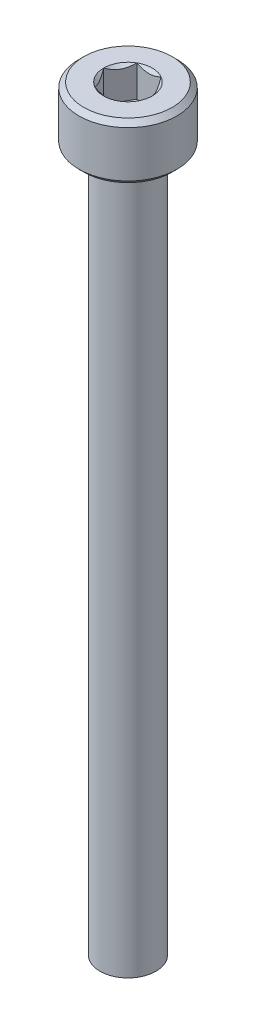
ISO-10303-21;
HEADER;
FILE_DESCRIPTION(('STEP AP214'),'2;1');
FILE_NAME('part.step','',(''),(''),'','','');
FILE_SCHEMA(('AUTOMOTIVE_DESIGN { 1 0 10303 214 1 1 1 1 }'));
ENDSEC;
DATA;
#1=APPLICATION_CONTEXT('core data for automotive mechanical design processes');
#2=APPLICATION_PROTOCOL_DEFINITION('international standard','automotive_design',2000,#1);
#3=PRODUCT_CONTEXT('',#1,'mechanical');
#4=PRODUCT('Part','Part','',(#3));
#5=PRODUCT_RELATED_PRODUCT_CATEGORY('part','',(#4));
#6=PRODUCT_DEFINITION_FORMATION('','',#4);
#7=PRODUCT_DEFINITION_CONTEXT('part definition',#1,'design');
#8=PRODUCT_DEFINITION('design','',#6,#7);
#9=PRODUCT_DEFINITION_SHAPE('','',#8);
#10=(LENGTH_UNIT() NAMED_UNIT(*) SI_UNIT(.MILLI.,.METRE.));
#11=(NAMED_UNIT(*) PLANE_ANGLE_UNIT() SI_UNIT($,.RADIAN.));
#12=(NAMED_UNIT(*) SI_UNIT($,.STERADIAN.) SOLID_ANGLE_UNIT());
#13=UNCERTAINTY_MEASURE_WITH_UNIT(LENGTH_MEASURE(1.E-05),#10,'distance_accuracy_value','');
#14=(GEOMETRIC_REPRESENTATION_CONTEXT(3) GLOBAL_UNCERTAINTY_ASSIGNED_CONTEXT((#13)) GLOBAL_UNIT_ASSIGNED_CONTEXT((#10,
#11,#12)) REPRESENTATION_CONTEXT('',''));
#15=CARTESIAN_POINT('',(0.,0.,0.));
#16=DIRECTION('',(0.,0.,1.));
#17=DIRECTION('',(1.,0.,0.));
#18=AXIS2_PLACEMENT_3D('',#15,#16,#17);
#19=CARTESIAN_POINT('',(0.,4.,0.));
#20=DIRECTION('',(0.,-1.,0.));
#21=DIRECTION('',(0.,0.,-1.));
#22=AXIS2_PLACEMENT_3D('',#19,#20,#21);
#23=CYLINDRICAL_SURFACE('',#22,3.5);
#24=CARTESIAN_POINT('',(0.,0.350000000000001,0.));
#25=DIRECTION('',(0.,1.,0.));
#26=DIRECTION('',(0.,0.,1.));
#27=AXIS2_PLACEMENT_3D('',#24,#25,#26);
#28=CIRCLE('',#27,3.5);
#29=CARTESIAN_POINT('',(0.,0.350000000000001,3.5));
#30=VERTEX_POINT('',#29);
#31=EDGE_CURVE('E222',#30,#30,#28,.T.);
#32=ORIENTED_EDGE('',*,*,#31,.T.);
#33=EDGE_LOOP('',(#32));
#34=FACE_BOUND('',#33,.T.);
#35=CARTESIAN_POINT('',(0.,3.65,0.));
#36=DIRECTION('',(0.,1.,0.));
#37=DIRECTION('',(0.,0.,1.));
#38=AXIS2_PLACEMENT_3D('',#35,#36,#37);
#39=CIRCLE('',#38,3.5);
#40=CARTESIAN_POINT('',(0.,3.65,3.5));
#41=VERTEX_POINT('',#40);
#42=EDGE_CURVE('E105',#41,#41,#39,.F.);
#43=ORIENTED_EDGE('',*,*,#42,.T.);
#44=EDGE_LOOP('',(#43));
#45=FACE_BOUND('',#44,.T.);
#46=ADVANCED_FACE('F33',(#34,#45),#23,.T.);
#47=CARTESIAN_POINT('',(0.,4.,0.));
#48=DIRECTION('',(0.,1.,0.));
#49=DIRECTION('',(0.,0.,1.));
#50=AXIS2_PLACEMENT_3D('',#47,#48,#49);
#51=PLANE('',#50);
#52=CARTESIAN_POINT('',(0.,4.,0.));
#53=DIRECTION('',(0.,1.,0.));
#54=DIRECTION('',(0.,0.,1.));
#55=AXIS2_PLACEMENT_3D('',#52,#53,#54);
#56=CIRCLE('',#55,3.15);
#57=CARTESIAN_POINT('',(0.,4.,3.15));
#58=VERTEX_POINT('',#57);
#59=EDGE_CURVE('E37',#58,#58,#56,.T.);
#60=ORIENTED_EDGE('',*,*,#59,.T.);
#61=EDGE_LOOP('',(#60));
#62=FACE_BOUND('',#61,.T.);
#63=CARTESIAN_POINT('',(0.,4.,0.));
#64=DIRECTION('',(0.,1.,0.));
#65=DIRECTION('',(0.,0.,1.));
#66=AXIS2_PLACEMENT_3D('',#63,#64,#65);
#67=CIRCLE('',#66,1.73205080756888);
#68=CARTESIAN_POINT('',(0.866025403784438,4.,1.5));
#69=VERTEX_POINT('',#68);
#70=CARTESIAN_POINT('',(1.73205080756888,4.,0.));
#71=VERTEX_POINT('',#70);
#72=EDGE_CURVE('E48',#69,#71,#67,.T.);
#73=ORIENTED_EDGE('',*,*,#72,.F.);
#74=CARTESIAN_POINT('',(-0.866025403784438,4.,1.5));
#75=VERTEX_POINT('',#74);
#76=EDGE_CURVE('E55',#75,#69,#67,.T.);
#77=ORIENTED_EDGE('',*,*,#76,.F.);
#78=CARTESIAN_POINT('',(-1.73205080756888,4.,0.));
#79=VERTEX_POINT('',#78);
#80=EDGE_CURVE('E128',#79,#75,#67,.T.);
#81=ORIENTED_EDGE('',*,*,#80,.F.);
#82=CARTESIAN_POINT('',(-0.866025403784439,4.,-1.5));
#83=VERTEX_POINT('',#82);
#84=EDGE_CURVE('E127',#83,#79,#67,.T.);
#85=ORIENTED_EDGE('',*,*,#84,.F.);
#86=CARTESIAN_POINT('',(0.866025403784438,4.,-1.5));
#87=VERTEX_POINT('',#86);
#88=EDGE_CURVE('E95',#87,#83,#67,.T.);
#89=ORIENTED_EDGE('',*,*,#88,.F.);
#90=EDGE_CURVE('E87',#71,#87,#67,.T.);
#91=ORIENTED_EDGE('',*,*,#90,.F.);
#92=EDGE_LOOP('',(#73,#77,#81,#85,#89,#91));
#93=FACE_BOUND('',#92,.T.);
#94=ADVANCED_FACE('F125',(#62,#93),#51,.T.);
#95=CARTESIAN_POINT('',(0.,0.,0.));
#96=DIRECTION('',(0.,1.,0.));
#97=DIRECTION('',(0.,0.,1.));
#98=AXIS2_PLACEMENT_3D('',#95,#96,#97);
#99=PLANE('',#98);
#100=CARTESIAN_POINT('',(0.,0.,0.));
#101=DIRECTION('',(0.,-1.,0.));
#102=DIRECTION('',(0.,0.,-1.));
#103=AXIS2_PLACEMENT_3D('',#100,#101,#102);
#104=CIRCLE('',#103,2.);
#105=CARTESIAN_POINT('',(0.,0.,-2.));
#106=VERTEX_POINT('',#105);
#107=EDGE_CURVE('E11',#106,#106,#104,.T.);
#108=ORIENTED_EDGE('',*,*,#107,.F.);
#109=EDGE_LOOP('',(#108));
#110=FACE_BOUND('',#109,.T.);
#111=CARTESIAN_POINT('',(0.,0.,0.));
#112=DIRECTION('',(0.,1.,0.));
#113=DIRECTION('',(0.,0.,1.));
#114=AXIS2_PLACEMENT_3D('',#111,#112,#113);
#115=CIRCLE('',#114,3.15);
#116=CARTESIAN_POINT('',(0.,0.,3.15));
#117=VERTEX_POINT('',#116);
#118=EDGE_CURVE('E220',#117,#117,#115,.F.);
#119=ORIENTED_EDGE('',*,*,#118,.T.);
#120=EDGE_LOOP('',(#119));
#121=FACE_BOUND('',#120,.T.);
#122=ADVANCED_FACE('F203',(#110,#121),#99,.F.);
#123=CARTESIAN_POINT('',(0.,4.,0.));
#124=DIRECTION('',(0.,1.,0.));
#125=DIRECTION('',(0.,0.,1.));
#126=AXIS2_PLACEMENT_3D('',#123,#124,#125);
#127=CONICAL_SURFACE('',#126,1.73205080756888,0.78539816339745);
#128=ORIENTED_EDGE('',*,*,#88,.T.);
#129=CARTESIAN_POINT('',(-1.72720812969692,4.55557851627079,-1.5));
#130=CARTESIAN_POINT('',(-1.68515175699268,4.52382990785743,-1.5));
#131=CARTESIAN_POINT('',(-1.64286104748673,4.49239259380738,-1.5));
#132=CARTESIAN_POINT('',(-1.55771581035942,4.43026908755641,-1.5));
#133=CARTESIAN_POINT('',(-1.51486114386668,4.3995830858922,-1.5));
#134=CARTESIAN_POINT('',(-1.3846813415127,4.30840719242716,-1.5));
#135=CARTESIAN_POINT('',(-1.29637976071654,4.24928834342677,-1.5));
#136=CARTESIAN_POINT('',(-1.11121478730467,4.1332309963165,-1.5));
#137=CARTESIAN_POINT('',(-1.01415038238167,4.07660955873301,-1.5));
#138=CARTESIAN_POINT('',(-0.815173408897606,3.97303688126565,-1.5));
#139=CARTESIAN_POINT('',(-0.713278669253285,3.92605304154167,-1.5));
#140=CARTESIAN_POINT('',(-0.560333774943112,3.86857266843083,-1.5));
#141=CARTESIAN_POINT('',(-0.511547982948042,3.85207538775725,-1.5));
#142=CARTESIAN_POINT('',(-0.412798620136866,3.822997512927,-1.5));
#143=CARTESIAN_POINT('',(-0.362834968437563,3.81041718859402,-1.5));
#144=CARTESIAN_POINT('',(-0.262863235444982,3.79003619414677,-1.5));
#145=CARTESIAN_POINT('',(-0.212872113808023,3.78215363274598,-1.5));
#146=CARTESIAN_POINT('',(-0.112355243569545,3.771322063969,-1.5));
#147=CARTESIAN_POINT('',(-0.0618295883726279,3.76837220852435,-1.5));
#148=CARTESIAN_POINT('',(0.037429173332384,3.76762485772485,-1.5));
#149=CARTESIAN_POINT('',(0.0861609672002989,3.76964473355808,-1.5));
#150=CARTESIAN_POINT('',(0.183206937768827,3.77832255289676,-1.5));
#151=CARTESIAN_POINT('',(0.231521073438269,3.78498094696846,-1.5));
#152=CARTESIAN_POINT('',(0.328199853425436,3.80268524412257,-1.5));
#153=CARTESIAN_POINT('',(0.376550616310328,3.81380581125704,-1.5));
#154=CARTESIAN_POINT('',(0.472195697125598,3.83984341404871,-1.5));
#155=CARTESIAN_POINT('',(0.51949010309274,3.85476013204094,-1.5));
#156=CARTESIAN_POINT('',(0.668391282696624,3.90733522359607,-1.5));
#157=CARTESIAN_POINT('',(0.767878709508552,3.95098128747198,-1.5));
#158=CARTESIAN_POINT('',(0.962179866690724,4.0480229945931,-1.5));
#159=CARTESIAN_POINT('',(1.05697519961444,4.10145366508953,-1.5));
#160=CARTESIAN_POINT('',(1.23814273533383,4.21168585200456,-1.5));
#161=CARTESIAN_POINT('',(1.3246994218129,4.2681879206986,-1.5));
#162=CARTESIAN_POINT('',(1.45222331290673,4.35553430157866,-1.5));
#163=CARTESIAN_POINT('',(1.49418091978756,4.38495775868004,-1.5));
#164=CARTESIAN_POINT('',(1.57752272931476,4.44458282183046,-1.5));
#165=CARTESIAN_POINT('',(1.61890708647354,4.47478421166444,-1.5));
#166=CARTESIAN_POINT('',(1.66005278019494,4.50530817860946,-1.5));
#167=B_SPLINE_CURVE_WITH_KNOTS('',3,(#129,#130,#131,#132,#133,#134,#135,#136,#137,#138,#139,
#140,#141,#142,#143,#144,#145,#146,#147,#148,#149,#150,#151,#152,#153,#154,#155,#156,#157,#158,
#159,#160,#161,#162,#163,#164,#165,#166),.UNSPECIFIED.,.F.,.F.,(4,2,2,2,2,2,2,2,2,2,2,2,2,2,2,2,
2,2,4),(0.,0.158079548982669,0.316198780993942,0.634850417346958,0.971690311361509,
1.30737131660667,1.46173961127089,1.61611853740677,1.76772101421409,1.91929742368538,
2.065387412096,2.21149159305544,2.36014984633872,2.50879566386709,2.83376031422673,
3.15991186985652,3.46985601802197,3.62358896039974,3.7772796264207),.UNSPECIFIED.);
#168=EDGE_CURVE('E100',#87,#83,#167,.F.);
#169=ORIENTED_EDGE('',*,*,#168,.F.);
#170=EDGE_LOOP('',(#128,#169));
#171=FACE_BOUND('',#170,.T.);
#172=ADVANCED_FACE('F101',(#171),#127,.F.);
#173=ORIENTED_EDGE('',*,*,#84,.T.);
#174=CARTESIAN_POINT('',(-0.865909933730601,4.00011548160007,-1.5002));
#175=CARTESIAN_POINT('',(-0.895682611594166,3.97036547606733,-1.44863220926292));
#176=CARTESIAN_POINT('',(-0.925953159489765,3.94236248391031,-1.3962020823348));
#177=CARTESIAN_POINT('',(-0.987678321317123,3.89108923044014,-1.2892909659444));
#178=CARTESIAN_POINT('',(-1.01913880822717,3.86784750504437,-1.23479980418534));
#179=CARTESIAN_POINT('',(-1.08257741237344,3.82803372899222,-1.12492091864275));
#180=CARTESIAN_POINT('',(-1.11453936608521,3.8113615856709,-1.0695611909048));
#181=CARTESIAN_POINT('',(-1.1791670593912,3.7856744568181,-0.957622742522849));
#182=CARTESIAN_POINT('',(-1.21183082354213,3.77664029047887,-0.901047443446992));
#183=CARTESIAN_POINT('',(-1.26812411040032,3.76848908122685,-0.803544610483559));
#184=CARTESIAN_POINT('',(-1.29168087824208,3.76728225298922,-0.762743091719534));
#185=CARTESIAN_POINT('',(-1.33875285845138,3.76931405716227,-0.681212030384142));
#186=CARTESIAN_POINT('',(-1.36226806050018,3.77255367074831,-0.64048250568537));
#187=CARTESIAN_POINT('',(-1.40907206156905,3.78329198598196,-0.559415597836584));
#188=CARTESIAN_POINT('',(-1.43236062923612,3.79079465301873,-0.519078615401712));
#189=CARTESIAN_POINT('',(-1.47854689118996,3.80965161192829,-0.439081663085969));
#190=CARTESIAN_POINT('',(-1.50144441326545,3.82100755701858,-0.399421991483792));
#191=CARTESIAN_POINT('',(-1.56009461325633,3.85472164759267,-0.297836865225515));
#192=CARTESIAN_POINT('',(-1.59548353987866,3.87962184909337,-0.236541446290311));
#193=CARTESIAN_POINT('',(-1.64751843074894,3.92165665327158,-0.146414371536686));
#194=CARTESIAN_POINT('',(-1.66466545167617,3.9364251535591,-0.116714860092282));
#195=CARTESIAN_POINT('',(-1.69864410935691,3.96731056594017,-0.0578620986162487));
#196=CARTESIAN_POINT('',(-1.71547589206761,3.98342683412171,-0.0287085957793624));
#197=CARTESIAN_POINT('',(-1.73216627762272,4.00011548160007,0.00020000000000028));
#198=B_SPLINE_CURVE_WITH_KNOTS('',3,(#174,#175,#176,#177,#178,#179,#180,#181,#182,#183,#184,
#185,#186,#187,#188,#189,#190,#191,#192,#193,#194,#195,#196,#197),.UNSPECIFIED.,.F.,.F.,(4,2,2,
2,2,2,2,2,2,2,2,4),(0.,0.199829143693304,0.400822987382388,0.598623720538181,0.795926240188889,
0.937113067959881,1.07833105577193,1.21968061668222,1.36109089931054,1.58570969637565,
1.69770705470964,1.80965120737194),.UNSPECIFIED.);
#199=EDGE_CURVE('E130',#83,#79,#198,.T.);
#200=ORIENTED_EDGE('',*,*,#199,.F.);
#201=EDGE_LOOP('',(#173,#200));
#202=FACE_BOUND('',#201,.T.);
#203=ADVANCED_FACE('F237',(#202),#127,.F.);
#204=ORIENTED_EDGE('',*,*,#80,.T.);
#205=CARTESIAN_POINT('',(-1.73216627762272,4.00011548160007,-0.000199999999999694));
#206=CARTESIAN_POINT('',(-1.70239359975915,3.97036547606733,0.051367790737076));
#207=CARTESIAN_POINT('',(-1.67212305186355,3.94236248391031,0.103797917665201));
#208=CARTESIAN_POINT('',(-1.61039789003619,3.89108923044014,0.210709034055597));
#209=CARTESIAN_POINT('',(-1.57893740312614,3.86784750504437,0.265200195814662));
#210=CARTESIAN_POINT('',(-1.51549879897987,3.82803372899222,0.375079081357249));
#211=CARTESIAN_POINT('',(-1.4835368452681,3.8113615856709,0.4304388090952));
#212=CARTESIAN_POINT('',(-1.41890915196211,3.7856744568181,0.542377257477151));
#213=CARTESIAN_POINT('',(-1.38624538781118,3.77664029047887,0.598952556553009));
#214=CARTESIAN_POINT('',(-1.32995210095299,3.76848908122685,0.696455389516441));
#215=CARTESIAN_POINT('',(-1.30639533311124,3.76728225298922,0.737256908280466));
#216=CARTESIAN_POINT('',(-1.25932335290193,3.76931405716227,0.818787969615858));
#217=CARTESIAN_POINT('',(-1.23580815085313,3.77255367074831,0.85951749431463));
#218=CARTESIAN_POINT('',(-1.18900414978427,3.78329198598196,0.940584402163416));
#219=CARTESIAN_POINT('',(-1.1657155821172,3.79079465301873,0.980921384598288));
#220=CARTESIAN_POINT('',(-1.11952932016335,3.80965161192829,1.06091833691403));
#221=CARTESIAN_POINT('',(-1.09663179808786,3.82100755701859,1.10057800851621));
#222=CARTESIAN_POINT('',(-1.03798159809698,3.85472164759267,1.20216313477448));
#223=CARTESIAN_POINT('',(-1.00259267147465,3.87962184909337,1.26345855370969));
#224=CARTESIAN_POINT('',(-0.950557780604375,3.92165665327158,1.35358562846331));
#225=CARTESIAN_POINT('',(-0.933410759677147,3.9364251535591,1.38328513990772));
#226=CARTESIAN_POINT('',(-0.899432101996407,3.96731056594017,1.44213790138375));
#227=CARTESIAN_POINT('',(-0.88260031928571,3.98342683412171,1.47129140422064));
#228=CARTESIAN_POINT('',(-0.865909933730601,4.00011548160007,1.5002));
#229=B_SPLINE_CURVE_WITH_KNOTS('',3,(#205,#206,#207,#208,#209,#210,#211,#212,#213,#214,#215,
#216,#217,#218,#219,#220,#221,#222,#223,#224,#225,#226,#227,#228),.UNSPECIFIED.,.F.,.F.,(4,2,2,
2,2,2,2,2,2,2,2,4),(0.,0.199829143693305,0.400822987382389,0.598623720538181,0.795926240188889,
0.937113067959881,1.07833105577193,1.21968061668222,1.36109089931054,1.58570969637565,
1.69770705470964,1.80965120737194),.UNSPECIFIED.);
#230=EDGE_CURVE('E139',#79,#75,#229,.T.);
#231=ORIENTED_EDGE('',*,*,#230,.F.);
#232=EDGE_LOOP('',(#204,#231));
#233=FACE_BOUND('',#232,.T.);
#234=ADVANCED_FACE('F252',(#233),#127,.F.);
#235=ORIENTED_EDGE('',*,*,#76,.T.);
#236=CARTESIAN_POINT('',(-1.72720812994822,4.55557851646053,1.5));
#237=CARTESIAN_POINT('',(-1.68515175723693,4.52382990803985,1.5));
#238=CARTESIAN_POINT('',(-1.64286104772391,4.49239259398251,1.5));
#239=CARTESIAN_POINT('',(-1.55771581058238,4.43026908771699,1.5));
#240=CARTESIAN_POINT('',(-1.51486114408249,4.39958308604553,1.5));
#241=CARTESIAN_POINT('',(-1.38468134170665,4.30840719255859,1.5));
#242=CARTESIAN_POINT('',(-1.29637976089561,4.24928834354366,1.5));
#243=CARTESIAN_POINT('',(-1.11121478745132,4.13323099640349,1.5));
#244=CARTESIAN_POINT('',(-1.01415038251067,4.07660955880473,1.5));
#245=CARTESIAN_POINT('',(-0.815173408989814,3.9730368813091,1.5));
#246=CARTESIAN_POINT('',(-0.71327866932636,3.92605304157206,1.5));
#247=CARTESIAN_POINT('',(-0.56033377500179,3.86857266845154,1.5));
#248=CARTESIAN_POINT('',(-0.511547983012749,3.85207538777834,1.5));
#249=CARTESIAN_POINT('',(-0.412798620213828,3.82299751294763,1.5));
#250=CARTESIAN_POINT('',(-0.362834968520751,3.8104171886138,1.5));
#251=CARTESIAN_POINT('',(-0.262863235540417,3.79003619416346,1.5));
#252=CARTESIAN_POINT('',(-0.212872113909475,3.78215363276045,1.5));
#253=CARTESIAN_POINT('',(-0.112355243682832,3.77132206397768,1.5));
#254=CARTESIAN_POINT('',(-0.061829588491731,3.76837220852945,1.5));
#255=CARTESIAN_POINT('',(0.0374291732025493,3.76762485772178,1.5));
#256=CARTESIAN_POINT('',(0.086160967065534,3.76964473355048,1.5));
#257=CARTESIAN_POINT('',(0.183206937624695,3.77832255287941,1.5));
#258=CARTESIAN_POINT('',(0.2315210732897,3.78498094694588,1.5));
#259=CARTESIAN_POINT('',(0.328199853268108,3.80268524408904,1.5));
#260=CARTESIAN_POINT('',(0.376550616148692,3.81380581121775,1.5));
#261=CARTESIAN_POINT('',(0.47219569695576,3.83984341399777,1.5));
#262=CARTESIAN_POINT('',(0.51949010291901,3.8547601319841,1.5));
#263=CARTESIAN_POINT('',(0.668391282485064,3.90733522351148,1.5));
#264=CARTESIAN_POINT('',(0.767878709264951,3.95098128736184,1.5));
#265=CARTESIAN_POINT('',(0.9621798663855,4.04802299442906,1.5));
#266=CARTESIAN_POINT('',(1.05697519927965,4.10145366489712,1.5));
#267=CARTESIAN_POINT('',(1.23814273494588,4.21168585175783,1.5));
#268=CARTESIAN_POINT('',(1.32469942140117,4.26818792042618,1.5));
#269=CARTESIAN_POINT('',(1.45222331245985,4.35553430126784,1.5));
#270=CARTESIAN_POINT('',(1.49418091932912,4.38495775835653,1.5));
#271=CARTESIAN_POINT('',(1.5775227288333,4.44458282148157,1.5));
#272=CARTESIAN_POINT('',(1.6189070859806,4.47478421130286,1.5));
#273=CARTESIAN_POINT('',(1.66005277969054,4.50530817823521,1.5));
#274=B_SPLINE_CURVE_WITH_KNOTS('',3,(#236,#237,#238,#239,#240,#241,#242,#243,#244,#245,#246,
#247,#248,#249,#250,#251,#252,#253,#254,#255,#256,#257,#258,#259,#260,#261,#262,#263,#264,#265,
#266,#267,#268,#269,#270,#271,#272,#273),.UNSPECIFIED.,.F.,.F.,(4,2,2,2,2,2,2,2,2,2,2,2,2,2,2,2,
2,2,4),(0.,0.158079549012757,0.316198781054129,0.634850417468465,0.971690311551782,
1.30737131686505,1.46173961151184,1.61611853763032,1.76772101442095,1.91929742387554,
2.06538741227089,2.21149159321503,2.36014984648185,2.50879566399376,2.83376031423511,
3.15991186974582,3.4698560178094,3.62358896013692,3.77727962610764),.UNSPECIFIED.);
#275=EDGE_CURVE('E166',#75,#69,#274,.T.);
#276=ORIENTED_EDGE('',*,*,#275,.F.);
#277=EDGE_LOOP('',(#235,#276));
#278=FACE_BOUND('',#277,.T.);
#279=ADVANCED_FACE('F282',(#278),#127,.F.);
#280=ORIENTED_EDGE('',*,*,#72,.T.);
#281=CARTESIAN_POINT('',(0.865909933730601,4.00011548160007,1.5002));
#282=CARTESIAN_POINT('',(0.895682611594166,3.97036547606733,1.44863220926292));
#283=CARTESIAN_POINT('',(0.925953159489765,3.94236248391031,1.3962020823348));
#284=CARTESIAN_POINT('',(0.987678321317124,3.89108923044014,1.2892909659444));
#285=CARTESIAN_POINT('',(1.01913880822717,3.86784750504437,1.23479980418534));
#286=CARTESIAN_POINT('',(1.08257741237344,3.82803372899222,1.12492091864275));
#287=CARTESIAN_POINT('',(1.11453936608521,3.8113615856709,1.0695611909048));
#288=CARTESIAN_POINT('',(1.1791670593912,3.7856744568181,0.95762274252285));
#289=CARTESIAN_POINT('',(1.21183082354213,3.77664029047887,0.901047443446992));
#290=CARTESIAN_POINT('',(1.26812411040032,3.76848908122685,0.80354461048356));
#291=CARTESIAN_POINT('',(1.29168087824208,3.76728225298922,0.762743091719534));
#292=CARTESIAN_POINT('',(1.33875285845138,3.76931405716227,0.681212030384142));
#293=CARTESIAN_POINT('',(1.36226806050018,3.77255367074831,0.640482505685371));
#294=CARTESIAN_POINT('',(1.40907206156905,3.78329198598196,0.559415597836584));
#295=CARTESIAN_POINT('',(1.43236062923612,3.79079465301873,0.519078615401712));
#296=CARTESIAN_POINT('',(1.47854689118996,3.80965161192829,0.43908166308597));
#297=CARTESIAN_POINT('',(1.50144441326545,3.82100755701859,0.399421991483792));
#298=CARTESIAN_POINT('',(1.56009461325633,3.85472164759267,0.297836865225515));
#299=CARTESIAN_POINT('',(1.59548353987866,3.87962184909337,0.236541446290311));
#300=CARTESIAN_POINT('',(1.64751843074894,3.92165665327158,0.146414371536686));
#301=CARTESIAN_POINT('',(1.66466545167617,3.9364251535591,0.116714860092282));
#302=CARTESIAN_POINT('',(1.69864410935691,3.96731056594017,0.0578620986162488));
#303=CARTESIAN_POINT('',(1.71547589206761,3.98342683412171,0.0287085957793626));
#304=CARTESIAN_POINT('',(1.73216627762272,4.00011548160007,-0.000200000000000026));
#305=B_SPLINE_CURVE_WITH_KNOTS('',3,(#281,#282,#283,#284,#285,#286,#287,#288,#289,#290,#291,
#292,#293,#294,#295,#296,#297,#298,#299,#300,#301,#302,#303,#304),.UNSPECIFIED.,.F.,.F.,(4,2,2,
2,2,2,2,2,2,2,2,4),(0.,0.199829143693305,0.400822987382389,0.59862372053818,0.795926240188889,
0.937113067959881,1.07833105577193,1.21968061668222,1.36109089931054,1.58570969637565,
1.69770705470964,1.80965120737194),.UNSPECIFIED.);
#306=EDGE_CURVE('E115',#69,#71,#305,.T.);
#307=ORIENTED_EDGE('',*,*,#306,.F.);
#308=EDGE_LOOP('',(#280,#307));
#309=FACE_BOUND('',#308,.T.);
#310=ADVANCED_FACE('F153',(#309),#127,.F.);
#311=ORIENTED_EDGE('',*,*,#90,.T.);
#312=CARTESIAN_POINT('',(1.73216627762272,4.00011548160007,0.000200000000000282));
#313=CARTESIAN_POINT('',(1.70239359975915,3.97036547606733,-0.0513677907370753));
#314=CARTESIAN_POINT('',(1.67212305186355,3.94236248391031,-0.103797917665201));
#315=CARTESIAN_POINT('',(1.61039789003619,3.89108923044014,-0.210709034055596));
#316=CARTESIAN_POINT('',(1.57893740312614,3.86784750504437,-0.265200195814661));
#317=CARTESIAN_POINT('',(1.51549879897987,3.82803372899222,-0.375079081357248));
#318=CARTESIAN_POINT('',(1.4835368452681,3.8113615856709,-0.430438809095199));
#319=CARTESIAN_POINT('',(1.41890915196211,3.7856744568181,-0.54237725747715));
#320=CARTESIAN_POINT('',(1.38624538781118,3.77664029047887,-0.598952556553008));
#321=CARTESIAN_POINT('',(1.32995210095299,3.76848908122685,-0.69645538951644));
#322=CARTESIAN_POINT('',(1.30639533311124,3.76728225298922,-0.737256908280466));
#323=CARTESIAN_POINT('',(1.25932335290193,3.76931405716227,-0.818787969615858));
#324=CARTESIAN_POINT('',(1.23580815085313,3.77255367074831,-0.85951749431463));
#325=CARTESIAN_POINT('',(1.18900414978427,3.78329198598196,-0.940584402163416));
#326=CARTESIAN_POINT('',(1.1657155821172,3.79079465301873,-0.980921384598288));
#327=CARTESIAN_POINT('',(1.11952932016335,3.80965161192829,-1.06091833691403));
#328=CARTESIAN_POINT('',(1.09663179808786,3.82100755701858,-1.10057800851621));
#329=CARTESIAN_POINT('',(1.03798159809698,3.85472164759267,-1.20216313477448));
#330=CARTESIAN_POINT('',(1.00259267147465,3.87962184909337,-1.26345855370969));
#331=CARTESIAN_POINT('',(0.950557780604375,3.92165665327158,-1.35358562846331));
#332=CARTESIAN_POINT('',(0.933410759677148,3.9364251535591,-1.38328513990772));
#333=CARTESIAN_POINT('',(0.899432101996407,3.96731056594017,-1.44213790138375));
#334=CARTESIAN_POINT('',(0.88260031928571,3.98342683412171,-1.47129140422064));
#335=CARTESIAN_POINT('',(0.865909933730601,4.00011548160007,-1.5002));
#336=B_SPLINE_CURVE_WITH_KNOTS('',3,(#312,#313,#314,#315,#316,#317,#318,#319,#320,#321,#322,
#323,#324,#325,#326,#327,#328,#329,#330,#331,#332,#333,#334,#335),.UNSPECIFIED.,.F.,.F.,(4,2,2,
2,2,2,2,2,2,2,2,4),(0.,0.199829143693305,0.400822987382389,0.598623720538181,0.79592624018889,
0.937113067959881,1.07833105577193,1.21968061668222,1.36109089931054,1.58570969637566,
1.69770705470964,1.80965120737194),.UNSPECIFIED.);
#337=EDGE_CURVE('E91',#71,#87,#336,.T.);
#338=ORIENTED_EDGE('',*,*,#337,.F.);
#339=EDGE_LOOP('',(#311,#338));
#340=FACE_BOUND('',#339,.T.);
#341=ADVANCED_FACE('F89',(#340),#127,.F.);
#342=CARTESIAN_POINT('',(0.,1.75,0.));
#343=DIRECTION('',(0.,1.,0.));
#344=DIRECTION('',(0.,0.,1.));
#345=AXIS2_PLACEMENT_3D('',#342,#343,#344);
#346=PLANE('',#345);
#347=DIRECTION('',(-0.5,0.,-0.866025403784439));
#348=VECTOR('',#347,1.);
#349=CARTESIAN_POINT('',(1.73205080756888,1.75,0.));
#350=LINE('',#349,#348);
#351=CARTESIAN_POINT('',(1.73205080756888,1.75,0.));
#352=VERTEX_POINT('',#351);
#353=CARTESIAN_POINT('',(0.866025403784438,1.75,-1.5));
#354=VERTEX_POINT('',#353);
#355=EDGE_CURVE('E114',#352,#354,#350,.T.);
#356=ORIENTED_EDGE('',*,*,#355,.T.);
#357=DIRECTION('',(-1.,0.,0.));
#358=VECTOR('',#357,1.);
#359=CARTESIAN_POINT('',(0.866025403784438,1.75,-1.5));
#360=LINE('',#359,#358);
#361=CARTESIAN_POINT('',(-0.866025403784439,1.75,-1.5));
#362=VERTEX_POINT('',#361);
#363=EDGE_CURVE('E119',#354,#362,#360,.T.);
#364=ORIENTED_EDGE('',*,*,#363,.T.);
#365=DIRECTION('',(-0.5,0.,0.866025403784439));
#366=VECTOR('',#365,1.);
#367=CARTESIAN_POINT('',(-0.866025403784439,1.75,-1.5));
#368=LINE('',#367,#366);
#369=CARTESIAN_POINT('',(-1.73205080756888,1.75,0.));
#370=VERTEX_POINT('',#369);
#371=EDGE_CURVE('E276',#362,#370,#368,.T.);
#372=ORIENTED_EDGE('',*,*,#371,.T.);
#373=DIRECTION('',(0.5,0.,0.866025403784439));
#374=VECTOR('',#373,1.);
#375=CARTESIAN_POINT('',(-1.73205080756888,1.75,0.));
#376=LINE('',#375,#374);
#377=CARTESIAN_POINT('',(-0.866025403784438,1.75,1.5));
#378=VERTEX_POINT('',#377);
#379=EDGE_CURVE('E259',#370,#378,#376,.T.);
#380=ORIENTED_EDGE('',*,*,#379,.T.);
#381=DIRECTION('',(1.,0.,0.));
#382=VECTOR('',#381,1.);
#383=CARTESIAN_POINT('',(-0.866025403784438,1.75,1.5));
#384=LINE('',#383,#382);
#385=CARTESIAN_POINT('',(0.866025403784439,1.75,1.5));
#386=VERTEX_POINT('',#385);
#387=EDGE_CURVE('E272',#378,#386,#384,.T.);
#388=ORIENTED_EDGE('',*,*,#387,.T.);
#389=DIRECTION('',(0.5,0.,-0.866025403784439));
#390=VECTOR('',#389,1.);
#391=CARTESIAN_POINT('',(0.866025403784439,1.75,1.5));
#392=LINE('',#391,#390);
#393=EDGE_CURVE('E122',#386,#352,#392,.T.);
#394=ORIENTED_EDGE('',*,*,#393,.T.);
#395=EDGE_LOOP('',(#356,#364,#372,#380,#388,#394));
#396=FACE_BOUND('',#395,.T.);
#397=ADVANCED_FACE('F152',(#396),#346,.T.);
#398=CARTESIAN_POINT('',(0.866025403784438,1.75,-1.5));
#399=DIRECTION('',(0.,0.,-1.));
#400=DIRECTION('',(-1.,0.,0.));
#401=AXIS2_PLACEMENT_3D('',#398,#399,#400);
#402=PLANE('',#401);
#403=DIRECTION('',(0.,1.,0.));
#404=VECTOR('',#403,1.);
#405=CARTESIAN_POINT('',(0.866025403784438,1.75,-1.5));
#406=LINE('',#405,#404);
#407=EDGE_CURVE('E112',#354,#87,#406,.T.);
#408=ORIENTED_EDGE('',*,*,#407,.T.);
#409=ORIENTED_EDGE('',*,*,#168,.T.);
#410=DIRECTION('',(0.,1.,0.));
#411=VECTOR('',#410,1.);
#412=CARTESIAN_POINT('',(-0.866025403784439,1.75,-1.5));
#413=LINE('',#412,#411);
#414=EDGE_CURVE('E121',#362,#83,#413,.T.);
#415=ORIENTED_EDGE('',*,*,#414,.F.);
#416=ORIENTED_EDGE('',*,*,#363,.F.);
#417=EDGE_LOOP('',(#408,#409,#415,#416));
#418=FACE_BOUND('',#417,.T.);
#419=ADVANCED_FACE('F117',(#418),#402,.F.);
#420=CARTESIAN_POINT('',(-0.866025403784439,1.75,-1.5));
#421=DIRECTION('',(-0.866025403784439,0.,-0.5));
#422=DIRECTION('',(-0.5,0.,0.866025403784439));
#423=AXIS2_PLACEMENT_3D('',#420,#421,#422);
#424=PLANE('',#423);
#425=ORIENTED_EDGE('',*,*,#414,.T.);
#426=ORIENTED_EDGE('',*,*,#199,.T.);
#427=DIRECTION('',(0.,1.,0.));
#428=VECTOR('',#427,1.);
#429=CARTESIAN_POINT('',(-1.73205080756888,1.75,0.));
#430=LINE('',#429,#428);
#431=EDGE_CURVE('E255',#370,#79,#430,.T.);
#432=ORIENTED_EDGE('',*,*,#431,.F.);
#433=ORIENTED_EDGE('',*,*,#371,.F.);
#434=EDGE_LOOP('',(#425,#426,#432,#433));
#435=FACE_BOUND('',#434,.T.);
#436=ADVANCED_FACE('F145',(#435),#424,.F.);
#437=CARTESIAN_POINT('',(-1.73205080756888,1.75,0.));
#438=DIRECTION('',(-0.866025403784439,0.,0.5));
#439=DIRECTION('',(0.5,0.,0.866025403784439));
#440=AXIS2_PLACEMENT_3D('',#437,#438,#439);
#441=PLANE('',#440);
#442=ORIENTED_EDGE('',*,*,#431,.T.);
#443=ORIENTED_EDGE('',*,*,#230,.T.);
#444=DIRECTION('',(0.,1.,0.));
#445=VECTOR('',#444,1.);
#446=CARTESIAN_POINT('',(-0.866025403784438,1.75,1.5));
#447=LINE('',#446,#445);
#448=EDGE_CURVE('E261',#378,#75,#447,.T.);
#449=ORIENTED_EDGE('',*,*,#448,.F.);
#450=ORIENTED_EDGE('',*,*,#379,.F.);
#451=EDGE_LOOP('',(#442,#443,#449,#450));
#452=FACE_BOUND('',#451,.T.);
#453=ADVANCED_FACE('F187',(#452),#441,.F.);
#454=CARTESIAN_POINT('',(-0.866025403784438,1.75,1.5));
#455=DIRECTION('',(0.,0.,1.));
#456=DIRECTION('',(1.,0.,0.));
#457=AXIS2_PLACEMENT_3D('',#454,#455,#456);
#458=PLANE('',#457);
#459=ORIENTED_EDGE('',*,*,#448,.T.);
#460=ORIENTED_EDGE('',*,*,#275,.T.);
#461=DIRECTION('',(0.,1.,0.));
#462=VECTOR('',#461,1.);
#463=CARTESIAN_POINT('',(0.866025403784439,1.75,1.5));
#464=LINE('',#463,#462);
#465=EDGE_CURVE('E263',#386,#69,#464,.T.);
#466=ORIENTED_EDGE('',*,*,#465,.F.);
#467=ORIENTED_EDGE('',*,*,#387,.F.);
#468=EDGE_LOOP('',(#459,#460,#466,#467));
#469=FACE_BOUND('',#468,.T.);
#470=ADVANCED_FACE('F183',(#469),#458,.F.);
#471=CARTESIAN_POINT('',(0.866025403784439,1.75,1.5));
#472=DIRECTION('',(0.866025403784439,0.,0.5));
#473=DIRECTION('',(0.5,0.,-0.866025403784439));
#474=AXIS2_PLACEMENT_3D('',#471,#472,#473);
#475=PLANE('',#474);
#476=ORIENTED_EDGE('',*,*,#465,.T.);
#477=ORIENTED_EDGE('',*,*,#306,.T.);
#478=DIRECTION('',(0.,1.,0.));
#479=VECTOR('',#478,1.);
#480=CARTESIAN_POINT('',(1.73205080756888,1.75,0.));
#481=LINE('',#480,#479);
#482=EDGE_CURVE('E106',#352,#71,#481,.T.);
#483=ORIENTED_EDGE('',*,*,#482,.F.);
#484=ORIENTED_EDGE('',*,*,#393,.F.);
#485=EDGE_LOOP('',(#476,#477,#483,#484));
#486=FACE_BOUND('',#485,.T.);
#487=ADVANCED_FACE('F180',(#486),#475,.F.);
#488=CARTESIAN_POINT('',(1.73205080756888,1.75,0.));
#489=DIRECTION('',(0.866025403784439,0.,-0.5));
#490=DIRECTION('',(-0.5,0.,-0.866025403784439));
#491=AXIS2_PLACEMENT_3D('',#488,#489,#490);
#492=PLANE('',#491);
#493=ORIENTED_EDGE('',*,*,#482,.T.);
#494=ORIENTED_EDGE('',*,*,#337,.T.);
#495=ORIENTED_EDGE('',*,*,#407,.F.);
#496=ORIENTED_EDGE('',*,*,#355,.F.);
#497=EDGE_LOOP('',(#493,#494,#495,#496));
#498=FACE_BOUND('',#497,.T.);
#499=ADVANCED_FACE('F110',(#498),#492,.F.);
#500=CARTESIAN_POINT('',(0.,0.350000000000001,0.));
#501=DIRECTION('',(0.,1.,0.));
#502=DIRECTION('',(0.,0.,1.));
#503=AXIS2_PLACEMENT_3D('',#500,#501,#502);
#504=CONICAL_SURFACE('',#503,3.5,0.78539816339745);
#505=ORIENTED_EDGE('',*,*,#118,.F.);
#506=EDGE_LOOP('',(#505));
#507=FACE_BOUND('',#506,.T.);
#508=ORIENTED_EDGE('',*,*,#31,.F.);
#509=EDGE_LOOP('',(#508));
#510=FACE_BOUND('',#509,.T.);
#511=ADVANCED_FACE('F209',(#507,#510),#504,.T.);
#512=CARTESIAN_POINT('',(0.,4.,0.));
#513=DIRECTION('',(0.,-1.,0.));
#514=DIRECTION('',(0.,0.,-1.));
#515=AXIS2_PLACEMENT_3D('',#512,#513,#514);
#516=CONICAL_SURFACE('',#515,3.15,0.785398163397448);
#517=ORIENTED_EDGE('',*,*,#42,.F.);
#518=EDGE_LOOP('',(#517));
#519=FACE_BOUND('',#518,.T.);
#520=ORIENTED_EDGE('',*,*,#59,.F.);
#521=EDGE_LOOP('',(#520));
#522=FACE_BOUND('',#521,.T.);
#523=ADVANCED_FACE('F35',(#519,#522),#516,.T.);
#524=CARTESIAN_POINT('',(0.,-50.,0.));
#525=DIRECTION('',(0.,1.,0.));
#526=DIRECTION('',(0.,0.,1.));
#527=AXIS2_PLACEMENT_3D('',#524,#525,#526);
#528=CYLINDRICAL_SURFACE('',#527,2.);
#529=CARTESIAN_POINT('',(0.,-50.,0.));
#530=DIRECTION('',(0.,-1.,0.));
#531=DIRECTION('',(0.,0.,-1.));
#532=AXIS2_PLACEMENT_3D('',#529,#530,#531);
#533=CIRCLE('',#532,2.);
#534=CARTESIAN_POINT('',(0.,-50.,-2.));
#535=VERTEX_POINT('',#534);
#536=EDGE_CURVE('E248',#535,#535,#533,.T.);
#537=ORIENTED_EDGE('',*,*,#536,.F.);
#538=EDGE_LOOP('',(#537));
#539=FACE_BOUND('',#538,.T.);
#540=ORIENTED_EDGE('',*,*,#107,.T.);
#541=EDGE_LOOP('',(#540));
#542=FACE_BOUND('',#541,.T.);
#543=ADVANCED_FACE('F154',(#539,#542),#528,.T.);
#544=CARTESIAN_POINT('',(0.,-50.,0.));
#545=DIRECTION('',(0.,-1.,0.));
#546=DIRECTION('',(0.,0.,-1.));
#547=AXIS2_PLACEMENT_3D('',#544,#545,#546);
#548=PLANE('',#547);
#549=ORIENTED_EDGE('',*,*,#536,.T.);
#550=EDGE_LOOP('',(#549));
#551=FACE_BOUND('',#550,.T.);
#552=ADVANCED_FACE('F241',(#551),#548,.T.);
#553=CLOSED_SHELL('',(#46,#94,#122,#172,#203,#234,#279,#310,#341,#397,#419,#436,#453,#470,#487,
#499,#511,#523,#543,#552));
#554=MANIFOLD_SOLID_BREP('B2',#553);
#555=ADVANCED_BREP_SHAPE_REPRESENTATION('',(#18,#554),#14);
#556=SHAPE_DEFINITION_REPRESENTATION(#9,#555);
ENDSEC;
END-ISO-10303-21;
